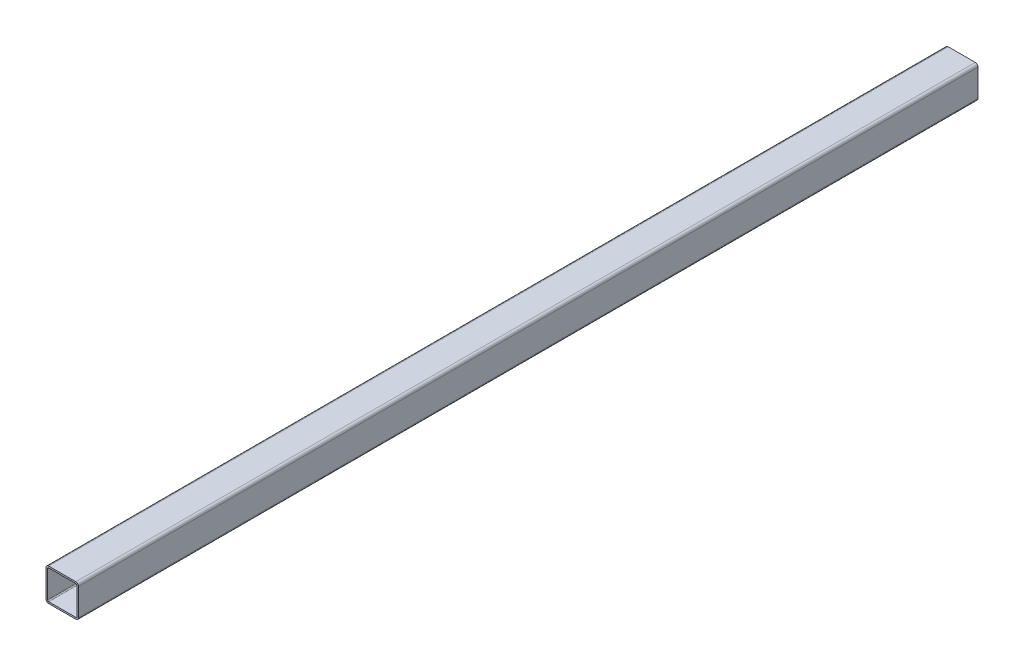
ISO-10303-21;
HEADER;
FILE_DESCRIPTION(('STEP AP214'),'2;1');
FILE_NAME('part.step','',(''),(''),'','','');
FILE_SCHEMA(('AUTOMOTIVE_DESIGN { 1 0 10303 214 1 1 1 1 }'));
ENDSEC;
DATA;
#1=APPLICATION_CONTEXT('core data for automotive mechanical design processes');
#2=APPLICATION_PROTOCOL_DEFINITION('international standard','automotive_design',2000,#1);
#3=PRODUCT_CONTEXT('',#1,'mechanical');
#4=PRODUCT('Part','Part','',(#3));
#5=PRODUCT_RELATED_PRODUCT_CATEGORY('part','',(#4));
#6=PRODUCT_DEFINITION_FORMATION('','',#4);
#7=PRODUCT_DEFINITION_CONTEXT('part definition',#1,'design');
#8=PRODUCT_DEFINITION('design','',#6,#7);
#9=PRODUCT_DEFINITION_SHAPE('','',#8);
#10=(LENGTH_UNIT() NAMED_UNIT(*) SI_UNIT(.MILLI.,.METRE.));
#11=(NAMED_UNIT(*) PLANE_ANGLE_UNIT() SI_UNIT($,.RADIAN.));
#12=(NAMED_UNIT(*) SI_UNIT($,.STERADIAN.) SOLID_ANGLE_UNIT());
#13=UNCERTAINTY_MEASURE_WITH_UNIT(LENGTH_MEASURE(1.E-05),#10,'distance_accuracy_value','');
#14=(GEOMETRIC_REPRESENTATION_CONTEXT(3) GLOBAL_UNCERTAINTY_ASSIGNED_CONTEXT((#13)) GLOBAL_UNIT_ASSIGNED_CONTEXT((#10,
#11,#12)) REPRESENTATION_CONTEXT('',''));
#15=CARTESIAN_POINT('',(0.,0.,0.));
#16=DIRECTION('',(0.,0.,1.));
#17=DIRECTION('',(1.,0.,0.));
#18=AXIS2_PLACEMENT_3D('',#15,#16,#17);
#19=CARTESIAN_POINT('',(25.0000000000004,24.9999999999996,830.));
#20=DIRECTION('',(0.,0.,-1.));
#21=DIRECTION('',(-1.,0.,0.));
#22=AXIS2_PLACEMENT_3D('',#19,#20,#21);
#23=PLANE('',#22);
#24=CARTESIAN_POINT('',(25.0000000000004,24.9999999999996,830.));
#25=DIRECTION('',(0.,0.,1.));
#26=DIRECTION('',(-1.,0.,0.));
#27=AXIS2_PLACEMENT_3D('',#24,#25,#26);
#28=CIRCLE('',#27,5.00000000000001);
#29=CARTESIAN_POINT('',(30.0000000000002,24.9999999999996,830.));
#30=VERTEX_POINT('',#29);
#31=CARTESIAN_POINT('',(25.0000000000004,29.9999999999996,830.));
#32=VERTEX_POINT('',#31);
#33=EDGE_CURVE('E200',#30,#32,#28,.T.);
#34=ORIENTED_EDGE('',*,*,#33,.T.);
#35=DIRECTION('',(-1.,0.,0.));
#36=VECTOR('',#35,1.);
#37=CARTESIAN_POINT('',(-24.9999999999988,29.9999999999996,830.));
#38=LINE('',#37,#36);
#39=CARTESIAN_POINT('',(-24.9999999999988,29.9999999999996,830.));
#40=VERTEX_POINT('',#39);
#41=EDGE_CURVE('E203',#32,#40,#38,.T.);
#42=ORIENTED_EDGE('',*,*,#41,.T.);
#43=CARTESIAN_POINT('',(-24.9999999999988,24.9999999999996,830.));
#44=DIRECTION('',(0.,0.,1.));
#45=DIRECTION('',(-1.,0.,0.));
#46=AXIS2_PLACEMENT_3D('',#43,#44,#45);
#47=CIRCLE('',#46,5.);
#48=CARTESIAN_POINT('',(-29.9999999999989,24.9999999999996,830.));
#49=VERTEX_POINT('',#48);
#50=EDGE_CURVE('E206',#40,#49,#47,.T.);
#51=ORIENTED_EDGE('',*,*,#50,.T.);
#52=DIRECTION('',(0.,-1.,0.));
#53=VECTOR('',#52,1.);
#54=CARTESIAN_POINT('',(-29.9999999999989,-24.9999999999996,830.));
#55=LINE('',#54,#53);
#56=CARTESIAN_POINT('',(-29.9999999999989,-24.9999999999996,830.));
#57=VERTEX_POINT('',#56);
#58=EDGE_CURVE('E208',#49,#57,#55,.T.);
#59=ORIENTED_EDGE('',*,*,#58,.T.);
#60=CARTESIAN_POINT('',(-24.9999999999988,-24.9999999999996,830.));
#61=DIRECTION('',(0.,0.,1.));
#62=DIRECTION('',(-1.,0.,0.));
#63=AXIS2_PLACEMENT_3D('',#60,#61,#62);
#64=CIRCLE('',#63,5.);
#65=CARTESIAN_POINT('',(-24.9999999999988,-29.9999999999996,830.));
#66=VERTEX_POINT('',#65);
#67=EDGE_CURVE('E210',#57,#66,#64,.T.);
#68=ORIENTED_EDGE('',*,*,#67,.T.);
#69=DIRECTION('',(1.,0.,0.));
#70=VECTOR('',#69,1.);
#71=CARTESIAN_POINT('',(-24.9999999999988,-29.9999999999996,830.));
#72=LINE('',#71,#70);
#73=CARTESIAN_POINT('',(25.0000000000004,-29.9999999999996,830.));
#74=VERTEX_POINT('',#73);
#75=EDGE_CURVE('E212',#66,#74,#72,.T.);
#76=ORIENTED_EDGE('',*,*,#75,.T.);
#77=CARTESIAN_POINT('',(25.0000000000004,-24.9999999999996,830.));
#78=DIRECTION('',(0.,0.,1.));
#79=DIRECTION('',(1.,0.,0.));
#80=AXIS2_PLACEMENT_3D('',#77,#78,#79);
#81=CIRCLE('',#80,5.);
#82=CARTESIAN_POINT('',(30.0000000000002,-24.9999999999996,830.));
#83=VERTEX_POINT('',#82);
#84=EDGE_CURVE('E214',#74,#83,#81,.T.);
#85=ORIENTED_EDGE('',*,*,#84,.T.);
#86=DIRECTION('',(0.,1.,0.));
#87=VECTOR('',#86,1.);
#88=CARTESIAN_POINT('',(30.0000000000002,-24.9999999999996,830.));
#89=LINE('',#88,#87);
#90=EDGE_CURVE('E216',#83,#30,#89,.T.);
#91=ORIENTED_EDGE('',*,*,#90,.T.);
#92=EDGE_LOOP('',(#34,#42,#51,#59,#68,#76,#85,#91));
#93=FACE_BOUND('',#92,.T.);
#94=CARTESIAN_POINT('',(25.0000000000004,24.9999999999996,830.));
#95=DIRECTION('',(0.,0.,-1.));
#96=DIRECTION('',(-1.,0.,0.));
#97=AXIS2_PLACEMENT_3D('',#94,#95,#96);
#98=CIRCLE('',#97,2.00000000000001);
#99=CARTESIAN_POINT('',(27.0000000000004,24.9999999999996,830.));
#100=VERTEX_POINT('',#99);
#101=CARTESIAN_POINT('',(25.0000000000004,26.9999999999996,830.));
#102=VERTEX_POINT('',#101);
#103=EDGE_CURVE('E171',#100,#102,#98,.F.);
#104=ORIENTED_EDGE('',*,*,#103,.F.);
#105=DIRECTION('',(0.,1.,0.));
#106=VECTOR('',#105,1.);
#107=CARTESIAN_POINT('',(27.0000000000004,24.9999999999996,830.));
#108=LINE('',#107,#106);
#109=CARTESIAN_POINT('',(27.0000000000004,-24.9999999999996,830.));
#110=VERTEX_POINT('',#109);
#111=EDGE_CURVE('E153',#110,#100,#108,.T.);
#112=ORIENTED_EDGE('',*,*,#111,.F.);
#113=CARTESIAN_POINT('',(25.0000000000004,-24.9999999999996,830.));
#114=DIRECTION('',(0.,0.,-1.));
#115=DIRECTION('',(-1.,0.,0.));
#116=AXIS2_PLACEMENT_3D('',#113,#114,#115);
#117=CIRCLE('',#116,2.);
#118=CARTESIAN_POINT('',(25.0000000000004,-26.9999999999996,830.));
#119=VERTEX_POINT('',#118);
#120=EDGE_CURVE('E197',#119,#110,#117,.F.);
#121=ORIENTED_EDGE('',*,*,#120,.F.);
#122=DIRECTION('',(1.,0.,0.));
#123=VECTOR('',#122,1.);
#124=CARTESIAN_POINT('',(25.0000000000004,-26.9999999999996,830.));
#125=LINE('',#124,#123);
#126=CARTESIAN_POINT('',(-24.9999999999988,-26.9999999999996,830.));
#127=VERTEX_POINT('',#126);
#128=EDGE_CURVE('E195',#127,#119,#125,.T.);
#129=ORIENTED_EDGE('',*,*,#128,.F.);
#130=CARTESIAN_POINT('',(-24.9999999999988,-24.9999999999996,830.));
#131=DIRECTION('',(0.,0.,-1.));
#132=DIRECTION('',(-1.,0.,0.));
#133=AXIS2_PLACEMENT_3D('',#130,#131,#132);
#134=CIRCLE('',#133,2.);
#135=CARTESIAN_POINT('',(-26.9999999999988,-24.9999999999996,830.));
#136=VERTEX_POINT('',#135);
#137=EDGE_CURVE('E193',#136,#127,#134,.F.);
#138=ORIENTED_EDGE('',*,*,#137,.F.);
#139=DIRECTION('',(0.,-1.,0.));
#140=VECTOR('',#139,1.);
#141=CARTESIAN_POINT('',(-26.9999999999988,24.9999999999996,830.));
#142=LINE('',#141,#140);
#143=CARTESIAN_POINT('',(-26.9999999999988,24.9999999999996,830.));
#144=VERTEX_POINT('',#143);
#145=EDGE_CURVE('E191',#144,#136,#142,.T.);
#146=ORIENTED_EDGE('',*,*,#145,.F.);
#147=CARTESIAN_POINT('',(-24.9999999999988,24.9999999999996,830.));
#148=DIRECTION('',(0.,0.,-1.));
#149=DIRECTION('',(-1.,0.,0.));
#150=AXIS2_PLACEMENT_3D('',#147,#148,#149);
#151=CIRCLE('',#150,2.);
#152=CARTESIAN_POINT('',(-24.9999999999988,26.9999999999996,830.));
#153=VERTEX_POINT('',#152);
#154=EDGE_CURVE('E189',#153,#144,#151,.F.);
#155=ORIENTED_EDGE('',*,*,#154,.F.);
#156=DIRECTION('',(-1.,0.,0.));
#157=VECTOR('',#156,1.);
#158=CARTESIAN_POINT('',(25.0000000000004,26.9999999999996,830.));
#159=LINE('',#158,#157);
#160=EDGE_CURVE('E173',#102,#153,#159,.T.);
#161=ORIENTED_EDGE('',*,*,#160,.F.);
#162=EDGE_LOOP('',(#104,#112,#121,#129,#138,#146,#155,#161));
#163=FACE_BOUND('',#162,.T.);
#164=ADVANCED_FACE('F34',(#93,#163),#23,.F.);
#165=CARTESIAN_POINT('',(25.0000000000004,24.9999999999996,-830.));
#166=DIRECTION('',(0.,0.,-1.));
#167=DIRECTION('',(-1.,0.,0.));
#168=AXIS2_PLACEMENT_3D('',#165,#166,#167);
#169=PLANE('',#168);
#170=CARTESIAN_POINT('',(25.0000000000004,24.9999999999996,-830.));
#171=DIRECTION('',(0.,0.,1.));
#172=DIRECTION('',(-1.,0.,0.));
#173=AXIS2_PLACEMENT_3D('',#170,#171,#172);
#174=CIRCLE('',#173,5.00000000000001);
#175=CARTESIAN_POINT('',(30.0000000000002,24.9999999999996,-830.));
#176=VERTEX_POINT('',#175);
#177=CARTESIAN_POINT('',(25.0000000000004,29.9999999999996,-830.));
#178=VERTEX_POINT('',#177);
#179=EDGE_CURVE('E219',#176,#178,#174,.T.);
#180=ORIENTED_EDGE('',*,*,#179,.F.);
#181=DIRECTION('',(0.,1.,0.));
#182=VECTOR('',#181,1.);
#183=CARTESIAN_POINT('',(30.0000000000002,-24.9999999999996,-830.));
#184=LINE('',#183,#182);
#185=CARTESIAN_POINT('',(30.0000000000002,-24.9999999999996,-830.));
#186=VERTEX_POINT('',#185);
#187=EDGE_CURVE('E204',#186,#176,#184,.T.);
#188=ORIENTED_EDGE('',*,*,#187,.F.);
#189=CARTESIAN_POINT('',(25.0000000000004,-24.9999999999996,-830.));
#190=DIRECTION('',(0.,0.,1.));
#191=DIRECTION('',(1.,0.,0.));
#192=AXIS2_PLACEMENT_3D('',#189,#190,#191);
#193=CIRCLE('',#192,5.);
#194=CARTESIAN_POINT('',(25.0000000000004,-29.9999999999996,-830.));
#195=VERTEX_POINT('',#194);
#196=EDGE_CURVE('E232',#195,#186,#193,.T.);
#197=ORIENTED_EDGE('',*,*,#196,.F.);
#198=DIRECTION('',(1.,0.,0.));
#199=VECTOR('',#198,1.);
#200=CARTESIAN_POINT('',(-24.9999999999988,-29.9999999999996,-830.));
#201=LINE('',#200,#199);
#202=CARTESIAN_POINT('',(-24.9999999999988,-29.9999999999996,-830.));
#203=VERTEX_POINT('',#202);
#204=EDGE_CURVE('E230',#203,#195,#201,.T.);
#205=ORIENTED_EDGE('',*,*,#204,.F.);
#206=CARTESIAN_POINT('',(-24.9999999999988,-24.9999999999996,-830.));
#207=DIRECTION('',(0.,0.,1.));
#208=DIRECTION('',(-1.,0.,0.));
#209=AXIS2_PLACEMENT_3D('',#206,#207,#208);
#210=CIRCLE('',#209,5.);
#211=CARTESIAN_POINT('',(-29.9999999999989,-24.9999999999996,-830.));
#212=VERTEX_POINT('',#211);
#213=EDGE_CURVE('E228',#212,#203,#210,.T.);
#214=ORIENTED_EDGE('',*,*,#213,.F.);
#215=DIRECTION('',(0.,-1.,0.));
#216=VECTOR('',#215,1.);
#217=CARTESIAN_POINT('',(-29.9999999999989,-24.9999999999996,-830.));
#218=LINE('',#217,#216);
#219=CARTESIAN_POINT('',(-29.9999999999989,24.9999999999996,-830.));
#220=VERTEX_POINT('',#219);
#221=EDGE_CURVE('E226',#220,#212,#218,.T.);
#222=ORIENTED_EDGE('',*,*,#221,.F.);
#223=CARTESIAN_POINT('',(-24.9999999999988,24.9999999999996,-830.));
#224=DIRECTION('',(0.,0.,1.));
#225=DIRECTION('',(-1.,0.,0.));
#226=AXIS2_PLACEMENT_3D('',#223,#224,#225);
#227=CIRCLE('',#226,5.);
#228=CARTESIAN_POINT('',(-24.9999999999988,29.9999999999996,-830.));
#229=VERTEX_POINT('',#228);
#230=EDGE_CURVE('E224',#229,#220,#227,.T.);
#231=ORIENTED_EDGE('',*,*,#230,.F.);
#232=DIRECTION('',(-1.,0.,0.));
#233=VECTOR('',#232,1.);
#234=CARTESIAN_POINT('',(-24.9999999999988,29.9999999999996,-830.));
#235=LINE('',#234,#233);
#236=EDGE_CURVE('E222',#178,#229,#235,.T.);
#237=ORIENTED_EDGE('',*,*,#236,.F.);
#238=EDGE_LOOP('',(#180,#188,#197,#205,#214,#222,#231,#237));
#239=FACE_BOUND('',#238,.T.);
#240=DIRECTION('',(0.,1.,0.));
#241=VECTOR('',#240,1.);
#242=CARTESIAN_POINT('',(27.0000000000004,24.9999999999996,-830.));
#243=LINE('',#242,#241);
#244=CARTESIAN_POINT('',(27.0000000000004,-24.9999999999996,-830.));
#245=VERTEX_POINT('',#244);
#246=CARTESIAN_POINT('',(27.0000000000004,24.9999999999996,-830.));
#247=VERTEX_POINT('',#246);
#248=EDGE_CURVE('E150',#245,#247,#243,.T.);
#249=ORIENTED_EDGE('',*,*,#248,.T.);
#250=CARTESIAN_POINT('',(25.0000000000004,24.9999999999996,-830.));
#251=DIRECTION('',(0.,0.,-1.));
#252=DIRECTION('',(-1.,0.,0.));
#253=AXIS2_PLACEMENT_3D('',#250,#251,#252);
#254=CIRCLE('',#253,2.00000000000001);
#255=CARTESIAN_POINT('',(25.0000000000004,26.9999999999996,-830.));
#256=VERTEX_POINT('',#255);
#257=EDGE_CURVE('E159',#247,#256,#254,.F.);
#258=ORIENTED_EDGE('',*,*,#257,.T.);
#259=DIRECTION('',(-1.,0.,0.));
#260=VECTOR('',#259,1.);
#261=CARTESIAN_POINT('',(25.0000000000004,26.9999999999996,-830.));
#262=LINE('',#261,#260);
#263=CARTESIAN_POINT('',(-24.9999999999988,26.9999999999996,-830.));
#264=VERTEX_POINT('',#263);
#265=EDGE_CURVE('E165',#256,#264,#262,.T.);
#266=ORIENTED_EDGE('',*,*,#265,.T.);
#267=CARTESIAN_POINT('',(-24.9999999999988,24.9999999999996,-830.));
#268=DIRECTION('',(0.,0.,-1.));
#269=DIRECTION('',(-1.,0.,0.));
#270=AXIS2_PLACEMENT_3D('',#267,#268,#269);
#271=CIRCLE('',#270,2.);
#272=CARTESIAN_POINT('',(-26.9999999999988,24.9999999999996,-830.));
#273=VERTEX_POINT('',#272);
#274=EDGE_CURVE('E57',#264,#273,#271,.F.);
#275=ORIENTED_EDGE('',*,*,#274,.T.);
#276=DIRECTION('',(0.,-1.,0.));
#277=VECTOR('',#276,1.);
#278=CARTESIAN_POINT('',(-26.9999999999988,24.9999999999996,-830.));
#279=LINE('',#278,#277);
#280=CARTESIAN_POINT('',(-26.9999999999988,-24.9999999999996,-830.));
#281=VERTEX_POINT('',#280);
#282=EDGE_CURVE('E183',#273,#281,#279,.T.);
#283=ORIENTED_EDGE('',*,*,#282,.T.);
#284=CARTESIAN_POINT('',(-24.9999999999988,-24.9999999999996,-830.));
#285=DIRECTION('',(0.,0.,-1.));
#286=DIRECTION('',(-1.,0.,0.));
#287=AXIS2_PLACEMENT_3D('',#284,#285,#286);
#288=CIRCLE('',#287,2.);
#289=CARTESIAN_POINT('',(-24.9999999999988,-26.9999999999996,-830.));
#290=VERTEX_POINT('',#289);
#291=EDGE_CURVE('E180',#281,#290,#288,.F.);
#292=ORIENTED_EDGE('',*,*,#291,.T.);
#293=DIRECTION('',(1.,0.,0.));
#294=VECTOR('',#293,1.);
#295=CARTESIAN_POINT('',(25.0000000000004,-26.9999999999996,-830.));
#296=LINE('',#295,#294);
#297=CARTESIAN_POINT('',(25.0000000000004,-26.9999999999996,-830.));
#298=VERTEX_POINT('',#297);
#299=EDGE_CURVE('E175',#290,#298,#296,.T.);
#300=ORIENTED_EDGE('',*,*,#299,.T.);
#301=CARTESIAN_POINT('',(25.0000000000004,-24.9999999999996,-830.));
#302=DIRECTION('',(0.,0.,-1.));
#303=DIRECTION('',(-1.,0.,0.));
#304=AXIS2_PLACEMENT_3D('',#301,#302,#303);
#305=CIRCLE('',#304,2.);
#306=EDGE_CURVE('E170',#298,#245,#305,.F.);
#307=ORIENTED_EDGE('',*,*,#306,.T.);
#308=EDGE_LOOP('',(#249,#258,#266,#275,#283,#292,#300,#307));
#309=FACE_BOUND('',#308,.T.);
#310=ADVANCED_FACE('F167',(#239,#309),#169,.T.);
#311=CARTESIAN_POINT('',(25.0000000000004,24.9999999999996,830.));
#312=DIRECTION('',(0.,0.,-1.));
#313=DIRECTION('',(-1.,0.,0.));
#314=AXIS2_PLACEMENT_3D('',#311,#312,#313);
#315=CYLINDRICAL_SURFACE('',#314,5.00000000000001);
#316=ORIENTED_EDGE('',*,*,#179,.T.);
#317=DIRECTION('',(0.,0.,-1.));
#318=VECTOR('',#317,1.);
#319=CARTESIAN_POINT('',(25.0000000000004,29.9999999999996,830.));
#320=LINE('',#319,#318);
#321=EDGE_CURVE('E11',#32,#178,#320,.T.);
#322=ORIENTED_EDGE('',*,*,#321,.F.);
#323=ORIENTED_EDGE('',*,*,#33,.F.);
#324=DIRECTION('',(0.,0.,-1.));
#325=VECTOR('',#324,1.);
#326=CARTESIAN_POINT('',(30.0000000000002,24.9999999999996,830.));
#327=LINE('',#326,#325);
#328=EDGE_CURVE('E218',#30,#176,#327,.T.);
#329=ORIENTED_EDGE('',*,*,#328,.T.);
#330=EDGE_LOOP('',(#316,#322,#323,#329));
#331=FACE_BOUND('',#330,.T.);
#332=ADVANCED_FACE('F36',(#331),#315,.T.);
#333=CARTESIAN_POINT('',(-24.9999999999988,29.9999999999996,830.));
#334=DIRECTION('',(0.,-1.,0.));
#335=DIRECTION('',(1.,0.,0.));
#336=AXIS2_PLACEMENT_3D('',#333,#334,#335);
#337=PLANE('',#336);
#338=ORIENTED_EDGE('',*,*,#236,.T.);
#339=DIRECTION('',(0.,0.,-1.));
#340=VECTOR('',#339,1.);
#341=CARTESIAN_POINT('',(-24.9999999999988,29.9999999999996,830.));
#342=LINE('',#341,#340);
#343=EDGE_CURVE('E42',#40,#229,#342,.T.);
#344=ORIENTED_EDGE('',*,*,#343,.F.);
#345=ORIENTED_EDGE('',*,*,#41,.F.);
#346=ORIENTED_EDGE('',*,*,#321,.T.);
#347=EDGE_LOOP('',(#338,#344,#345,#346));
#348=FACE_BOUND('',#347,.T.);
#349=ADVANCED_FACE('F278',(#348),#337,.F.);
#350=CARTESIAN_POINT('',(-24.9999999999988,24.9999999999996,830.));
#351=DIRECTION('',(0.,0.,-1.));
#352=DIRECTION('',(-1.,0.,0.));
#353=AXIS2_PLACEMENT_3D('',#350,#351,#352);
#354=CYLINDRICAL_SURFACE('',#353,5.);
#355=ORIENTED_EDGE('',*,*,#230,.T.);
#356=DIRECTION('',(0.,0.,-1.));
#357=VECTOR('',#356,1.);
#358=CARTESIAN_POINT('',(-29.9999999999989,24.9999999999996,830.));
#359=LINE('',#358,#357);
#360=EDGE_CURVE('E249',#49,#220,#359,.T.);
#361=ORIENTED_EDGE('',*,*,#360,.F.);
#362=ORIENTED_EDGE('',*,*,#50,.F.);
#363=ORIENTED_EDGE('',*,*,#343,.T.);
#364=EDGE_LOOP('',(#355,#361,#362,#363));
#365=FACE_BOUND('',#364,.T.);
#366=ADVANCED_FACE('F256',(#365),#354,.T.);
#367=CARTESIAN_POINT('',(-29.9999999999989,-24.9999999999996,830.));
#368=DIRECTION('',(1.,0.,0.));
#369=DIRECTION('',(0.,1.,0.));
#370=AXIS2_PLACEMENT_3D('',#367,#368,#369);
#371=PLANE('',#370);
#372=ORIENTED_EDGE('',*,*,#221,.T.);
#373=DIRECTION('',(0.,0.,-1.));
#374=VECTOR('',#373,1.);
#375=CARTESIAN_POINT('',(-29.9999999999989,-24.9999999999996,830.));
#376=LINE('',#375,#374);
#377=EDGE_CURVE('E246',#57,#212,#376,.T.);
#378=ORIENTED_EDGE('',*,*,#377,.F.);
#379=ORIENTED_EDGE('',*,*,#58,.F.);
#380=ORIENTED_EDGE('',*,*,#360,.T.);
#381=EDGE_LOOP('',(#372,#378,#379,#380));
#382=FACE_BOUND('',#381,.T.);
#383=ADVANCED_FACE('F266',(#382),#371,.F.);
#384=CARTESIAN_POINT('',(-24.9999999999988,-24.9999999999996,830.));
#385=DIRECTION('',(0.,0.,-1.));
#386=DIRECTION('',(-1.,0.,0.));
#387=AXIS2_PLACEMENT_3D('',#384,#385,#386);
#388=CYLINDRICAL_SURFACE('',#387,5.);
#389=ORIENTED_EDGE('',*,*,#213,.T.);
#390=DIRECTION('',(0.,0.,-1.));
#391=VECTOR('',#390,1.);
#392=CARTESIAN_POINT('',(-24.9999999999988,-29.9999999999996,830.));
#393=LINE('',#392,#391);
#394=EDGE_CURVE('E243',#66,#203,#393,.T.);
#395=ORIENTED_EDGE('',*,*,#394,.F.);
#396=ORIENTED_EDGE('',*,*,#67,.F.);
#397=ORIENTED_EDGE('',*,*,#377,.T.);
#398=EDGE_LOOP('',(#389,#395,#396,#397));
#399=FACE_BOUND('',#398,.T.);
#400=ADVANCED_FACE('F270',(#399),#388,.T.);
#401=CARTESIAN_POINT('',(-24.9999999999988,-29.9999999999996,830.));
#402=DIRECTION('',(0.,1.,0.));
#403=DIRECTION('',(0.,0.,1.));
#404=AXIS2_PLACEMENT_3D('',#401,#402,#403);
#405=PLANE('',#404);
#406=ORIENTED_EDGE('',*,*,#204,.T.);
#407=DIRECTION('',(0.,0.,-1.));
#408=VECTOR('',#407,1.);
#409=CARTESIAN_POINT('',(25.0000000000004,-29.9999999999996,830.));
#410=LINE('',#409,#408);
#411=EDGE_CURVE('E240',#74,#195,#410,.T.);
#412=ORIENTED_EDGE('',*,*,#411,.F.);
#413=ORIENTED_EDGE('',*,*,#75,.F.);
#414=ORIENTED_EDGE('',*,*,#394,.T.);
#415=EDGE_LOOP('',(#406,#412,#413,#414));
#416=FACE_BOUND('',#415,.T.);
#417=ADVANCED_FACE('F291',(#416),#405,.F.);
#418=CARTESIAN_POINT('',(25.0000000000004,-24.9999999999996,830.));
#419=DIRECTION('',(0.,0.,-1.));
#420=DIRECTION('',(-1.,0.,0.));
#421=AXIS2_PLACEMENT_3D('',#418,#419,#420);
#422=CYLINDRICAL_SURFACE('',#421,5.);
#423=ORIENTED_EDGE('',*,*,#196,.T.);
#424=DIRECTION('',(0.,0.,-1.));
#425=VECTOR('',#424,1.);
#426=CARTESIAN_POINT('',(30.0000000000002,-24.9999999999996,830.));
#427=LINE('',#426,#425);
#428=EDGE_CURVE('E237',#83,#186,#427,.T.);
#429=ORIENTED_EDGE('',*,*,#428,.F.);
#430=ORIENTED_EDGE('',*,*,#84,.F.);
#431=ORIENTED_EDGE('',*,*,#411,.T.);
#432=EDGE_LOOP('',(#423,#429,#430,#431));
#433=FACE_BOUND('',#432,.T.);
#434=ADVANCED_FACE('F289',(#433),#422,.T.);
#435=CARTESIAN_POINT('',(30.0000000000002,-24.9999999999996,830.));
#436=DIRECTION('',(-1.,0.,0.));
#437=DIRECTION('',(0.,-1.,0.));
#438=AXIS2_PLACEMENT_3D('',#435,#436,#437);
#439=PLANE('',#438);
#440=ORIENTED_EDGE('',*,*,#187,.T.);
#441=ORIENTED_EDGE('',*,*,#328,.F.);
#442=ORIENTED_EDGE('',*,*,#90,.F.);
#443=ORIENTED_EDGE('',*,*,#428,.T.);
#444=EDGE_LOOP('',(#440,#441,#442,#443));
#445=FACE_BOUND('',#444,.T.);
#446=ADVANCED_FACE('F284',(#445),#439,.F.);
#447=CARTESIAN_POINT('',(25.0000000000004,24.9999999999996,830.));
#448=DIRECTION('',(0.,0.,-1.));
#449=DIRECTION('',(-1.,0.,0.));
#450=AXIS2_PLACEMENT_3D('',#447,#448,#449);
#451=CYLINDRICAL_SURFACE('',#450,2.00000000000001);
#452=ORIENTED_EDGE('',*,*,#257,.F.);
#453=DIRECTION('',(0.,0.,-1.));
#454=VECTOR('',#453,1.);
#455=CARTESIAN_POINT('',(27.0000000000004,24.9999999999996,830.));
#456=LINE('',#455,#454);
#457=EDGE_CURVE('E146',#100,#247,#456,.T.);
#458=ORIENTED_EDGE('',*,*,#457,.F.);
#459=ORIENTED_EDGE('',*,*,#103,.T.);
#460=DIRECTION('',(0.,0.,1.));
#461=VECTOR('',#460,1.);
#462=CARTESIAN_POINT('',(25.0000000000004,26.9999999999996,830.));
#463=LINE('',#462,#461);
#464=EDGE_CURVE('E162',#102,#256,#463,.F.);
#465=ORIENTED_EDGE('',*,*,#464,.T.);
#466=EDGE_LOOP('',(#452,#458,#459,#465));
#467=FACE_BOUND('',#466,.T.);
#468=ADVANCED_FACE('F160',(#467),#451,.F.);
#469=CARTESIAN_POINT('',(-24.9999999999988,26.9999999999996,830.));
#470=DIRECTION('',(0.,-1.,0.));
#471=DIRECTION('',(1.,0.,0.));
#472=AXIS2_PLACEMENT_3D('',#469,#470,#471);
#473=PLANE('',#472);
#474=ORIENTED_EDGE('',*,*,#265,.F.);
#475=ORIENTED_EDGE('',*,*,#464,.F.);
#476=ORIENTED_EDGE('',*,*,#160,.T.);
#477=DIRECTION('',(0.,0.,-1.));
#478=VECTOR('',#477,1.);
#479=CARTESIAN_POINT('',(-24.9999999999988,26.9999999999996,830.));
#480=LINE('',#479,#478);
#481=EDGE_CURVE('E356',#153,#264,#480,.T.);
#482=ORIENTED_EDGE('',*,*,#481,.T.);
#483=EDGE_LOOP('',(#474,#475,#476,#482));
#484=FACE_BOUND('',#483,.T.);
#485=ADVANCED_FACE('F313',(#484),#473,.T.);
#486=CARTESIAN_POINT('',(-24.9999999999988,24.9999999999996,830.));
#487=DIRECTION('',(0.,0.,-1.));
#488=DIRECTION('',(-1.,0.,0.));
#489=AXIS2_PLACEMENT_3D('',#486,#487,#488);
#490=CYLINDRICAL_SURFACE('',#489,2.);
#491=ORIENTED_EDGE('',*,*,#274,.F.);
#492=ORIENTED_EDGE('',*,*,#481,.F.);
#493=ORIENTED_EDGE('',*,*,#154,.T.);
#494=DIRECTION('',(0.,0.,1.));
#495=VECTOR('',#494,1.);
#496=CARTESIAN_POINT('',(-26.9999999999988,24.9999999999996,830.));
#497=LINE('',#496,#495);
#498=EDGE_CURVE('E354',#144,#273,#497,.F.);
#499=ORIENTED_EDGE('',*,*,#498,.T.);
#500=EDGE_LOOP('',(#491,#492,#493,#499));
#501=FACE_BOUND('',#500,.T.);
#502=ADVANCED_FACE('F318',(#501),#490,.F.);
#503=CARTESIAN_POINT('',(-26.9999999999988,-24.9999999999996,830.));
#504=DIRECTION('',(1.,0.,0.));
#505=DIRECTION('',(0.,1.,0.));
#506=AXIS2_PLACEMENT_3D('',#503,#504,#505);
#507=PLANE('',#506);
#508=ORIENTED_EDGE('',*,*,#282,.F.);
#509=ORIENTED_EDGE('',*,*,#498,.F.);
#510=ORIENTED_EDGE('',*,*,#145,.T.);
#511=DIRECTION('',(0.,0.,-1.));
#512=VECTOR('',#511,1.);
#513=CARTESIAN_POINT('',(-26.9999999999988,-24.9999999999996,830.));
#514=LINE('',#513,#512);
#515=EDGE_CURVE('E350',#136,#281,#514,.T.);
#516=ORIENTED_EDGE('',*,*,#515,.T.);
#517=EDGE_LOOP('',(#508,#509,#510,#516));
#518=FACE_BOUND('',#517,.T.);
#519=ADVANCED_FACE('F324',(#518),#507,.T.);
#520=CARTESIAN_POINT('',(-24.9999999999988,-24.9999999999996,830.));
#521=DIRECTION('',(0.,0.,-1.));
#522=DIRECTION('',(-1.,0.,0.));
#523=AXIS2_PLACEMENT_3D('',#520,#521,#522);
#524=CYLINDRICAL_SURFACE('',#523,2.);
#525=ORIENTED_EDGE('',*,*,#291,.F.);
#526=ORIENTED_EDGE('',*,*,#515,.F.);
#527=ORIENTED_EDGE('',*,*,#137,.T.);
#528=DIRECTION('',(0.,0.,1.));
#529=VECTOR('',#528,1.);
#530=CARTESIAN_POINT('',(-24.9999999999988,-26.9999999999996,830.));
#531=LINE('',#530,#529);
#532=EDGE_CURVE('E347',#127,#290,#531,.F.);
#533=ORIENTED_EDGE('',*,*,#532,.T.);
#534=EDGE_LOOP('',(#525,#526,#527,#533));
#535=FACE_BOUND('',#534,.T.);
#536=ADVANCED_FACE('F327',(#535),#524,.F.);
#537=CARTESIAN_POINT('',(-24.9999999999988,-26.9999999999996,830.));
#538=DIRECTION('',(0.,1.,0.));
#539=DIRECTION('',(0.,0.,1.));
#540=AXIS2_PLACEMENT_3D('',#537,#538,#539);
#541=PLANE('',#540);
#542=ORIENTED_EDGE('',*,*,#299,.F.);
#543=ORIENTED_EDGE('',*,*,#532,.F.);
#544=ORIENTED_EDGE('',*,*,#128,.T.);
#545=DIRECTION('',(0.,0.,-1.));
#546=VECTOR('',#545,1.);
#547=CARTESIAN_POINT('',(25.0000000000004,-26.9999999999996,830.));
#548=LINE('',#547,#546);
#549=EDGE_CURVE('E342',#119,#298,#548,.T.);
#550=ORIENTED_EDGE('',*,*,#549,.T.);
#551=EDGE_LOOP('',(#542,#543,#544,#550));
#552=FACE_BOUND('',#551,.T.);
#553=ADVANCED_FACE('F331',(#552),#541,.T.);
#554=CARTESIAN_POINT('',(25.0000000000004,-24.9999999999996,830.));
#555=DIRECTION('',(0.,0.,-1.));
#556=DIRECTION('',(-1.,0.,0.));
#557=AXIS2_PLACEMENT_3D('',#554,#555,#556);
#558=CYLINDRICAL_SURFACE('',#557,2.);
#559=ORIENTED_EDGE('',*,*,#306,.F.);
#560=ORIENTED_EDGE('',*,*,#549,.F.);
#561=ORIENTED_EDGE('',*,*,#120,.T.);
#562=DIRECTION('',(0.,0.,1.));
#563=VECTOR('',#562,1.);
#564=CARTESIAN_POINT('',(27.0000000000004,-24.9999999999996,830.));
#565=LINE('',#564,#563);
#566=EDGE_CURVE('E49',#110,#245,#565,.F.);
#567=ORIENTED_EDGE('',*,*,#566,.T.);
#568=EDGE_LOOP('',(#559,#560,#561,#567));
#569=FACE_BOUND('',#568,.T.);
#570=ADVANCED_FACE('F334',(#569),#558,.F.);
#571=CARTESIAN_POINT('',(27.0000000000004,-24.9999999999996,830.));
#572=DIRECTION('',(-1.,0.,0.));
#573=DIRECTION('',(0.,-1.,0.));
#574=AXIS2_PLACEMENT_3D('',#571,#572,#573);
#575=PLANE('',#574);
#576=ORIENTED_EDGE('',*,*,#248,.F.);
#577=ORIENTED_EDGE('',*,*,#566,.F.);
#578=ORIENTED_EDGE('',*,*,#111,.T.);
#579=ORIENTED_EDGE('',*,*,#457,.T.);
#580=EDGE_LOOP('',(#576,#577,#578,#579));
#581=FACE_BOUND('',#580,.T.);
#582=ADVANCED_FACE('F148',(#581),#575,.T.);
#583=CLOSED_SHELL('',(#164,#310,#332,#349,#366,#383,#400,#417,#434,#446,#468,#485,#502,#519,
#536,#553,#570,#582));
#584=MANIFOLD_SOLID_BREP('B2',#583);
#585=ADVANCED_BREP_SHAPE_REPRESENTATION('',(#18,#584),#14);
#586=SHAPE_DEFINITION_REPRESENTATION(#9,#585);
ENDSEC;
END-ISO-10303-21;
